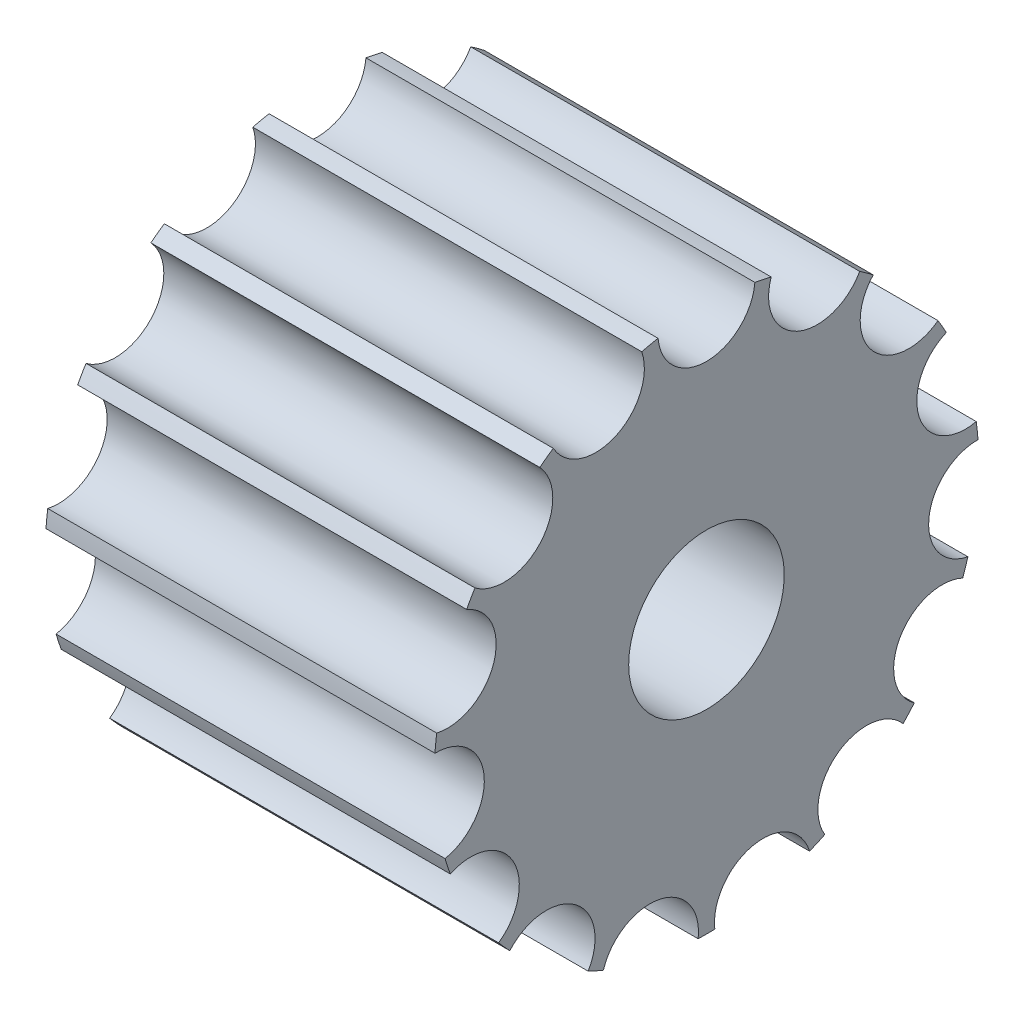
ISO-10303-21;
HEADER;
FILE_DESCRIPTION(('STEP AP214'),'2;1');
FILE_NAME('part.step','',(''),(''),'','','');
FILE_SCHEMA(('AUTOMOTIVE_DESIGN { 1 0 10303 214 1 1 1 1 }'));
ENDSEC;
DATA;
#1=APPLICATION_CONTEXT('core data for automotive mechanical design processes');
#2=APPLICATION_PROTOCOL_DEFINITION('international standard','automotive_design',2000,#1);
#3=PRODUCT_CONTEXT('',#1,'mechanical');
#4=PRODUCT('Part','Part','',(#3));
#5=PRODUCT_RELATED_PRODUCT_CATEGORY('part','',(#4));
#6=PRODUCT_DEFINITION_FORMATION('','',#4);
#7=PRODUCT_DEFINITION_CONTEXT('part definition',#1,'design');
#8=PRODUCT_DEFINITION('design','',#6,#7);
#9=PRODUCT_DEFINITION_SHAPE('','',#8);
#10=(LENGTH_UNIT() NAMED_UNIT(*) SI_UNIT(.MILLI.,.METRE.));
#11=(NAMED_UNIT(*) PLANE_ANGLE_UNIT() SI_UNIT($,.RADIAN.));
#12=(NAMED_UNIT(*) SI_UNIT($,.STERADIAN.) SOLID_ANGLE_UNIT());
#13=UNCERTAINTY_MEASURE_WITH_UNIT(LENGTH_MEASURE(1.E-05),#10,'distance_accuracy_value','');
#14=(GEOMETRIC_REPRESENTATION_CONTEXT(3) GLOBAL_UNCERTAINTY_ASSIGNED_CONTEXT((#13)) GLOBAL_UNIT_ASSIGNED_CONTEXT((#10,
#11,#12)) REPRESENTATION_CONTEXT('',''));
#15=CARTESIAN_POINT('',(0.,0.,0.));
#16=DIRECTION('',(0.,0.,1.));
#17=DIRECTION('',(1.,0.,0.));
#18=AXIS2_PLACEMENT_3D('',#15,#16,#17);
#19=CARTESIAN_POINT('',(-48.9644918561277,1.84719136614903,0.));
#20=DIRECTION('',(-1.,0.,0.));
#21=DIRECTION('',(0.,0.,1.));
#22=AXIS2_PLACEMENT_3D('',#19,#20,#21);
#23=CYLINDRICAL_SURFACE('',#22,7.);
#24=CARTESIAN_POINT('',(-27.3637349174757,1.84719136614903,0.));
#25=DIRECTION('',(-1.,0.,0.));
#26=DIRECTION('',(0.,0.,1.));
#27=AXIS2_PLACEMENT_3D('',#24,#25,#26);
#28=CIRCLE('',#27,7.);
#29=CARTESIAN_POINT('',(-27.3637349174757,-2.99383843144402,5.05612801448067));
#30=VERTEX_POINT('',#29);
#31=CARTESIAN_POINT('',(-27.3637349174757,-2.6752132446615,5.3430194212748));
#32=VERTEX_POINT('',#31);
#33=EDGE_CURVE('E255',#30,#32,#28,.T.);
#34=ORIENTED_EDGE('',*,*,#33,.F.);
#35=DIRECTION('',(-1.,0.,0.));
#36=VECTOR('',#35,1.);
#37=CARTESIAN_POINT('',(-10.3637349174757,-2.99383843144402,5.05612801448067));
#38=LINE('',#37,#36);
#39=CARTESIAN_POINT('',(-17.3637349174757,-2.99383843144402,5.05612801448067));
#40=VERTEX_POINT('',#39);
#41=EDGE_CURVE('E406',#40,#30,#38,.T.);
#42=ORIENTED_EDGE('',*,*,#41,.F.);
#43=CARTESIAN_POINT('',(-17.3637349174757,1.84719136614903,0.));
#44=DIRECTION('',(-1.,0.,0.));
#45=DIRECTION('',(0.,0.,1.));
#46=AXIS2_PLACEMENT_3D('',#43,#44,#45);
#47=CIRCLE('',#46,7.);
#48=CARTESIAN_POINT('',(-17.3637349174757,-2.6752132446615,5.3430194212748));
#49=VERTEX_POINT('',#48);
#50=EDGE_CURVE('E257',#40,#49,#47,.T.);
#51=ORIENTED_EDGE('',*,*,#50,.T.);
#52=DIRECTION('',(-1.,0.,0.));
#53=VECTOR('',#52,1.);
#54=CARTESIAN_POINT('',(-10.3637349174757,-2.6752132446615,5.3430194212748));
#55=LINE('',#54,#53);
#56=EDGE_CURVE('E240',#49,#32,#55,.T.);
#57=ORIENTED_EDGE('',*,*,#56,.T.);
#58=EDGE_LOOP('',(#34,#42,#51,#57));
#59=FACE_BOUND('',#58,.T.);
#60=ADVANCED_FACE('F39',(#59),#23,.T.);
#61=CARTESIAN_POINT('',(-17.3637349174757,-4.63182195132596,2.6499785719854));
#62=VERTEX_POINT('',#61);
#63=CARTESIAN_POINT('',(-17.3637349174757,-4.457432606977,3.04166345237019));
#64=VERTEX_POINT('',#63);
#65=EDGE_CURVE('E601',#62,#64,#47,.T.);
#66=ORIENTED_EDGE('',*,*,#65,.T.);
#67=DIRECTION('',(-1.,0.,0.));
#68=VECTOR('',#67,1.);
#69=CARTESIAN_POINT('',(-10.3637349174757,-4.457432606977,3.04166345237019));
#70=LINE('',#69,#68);
#71=CARTESIAN_POINT('',(-27.3637349174757,-4.457432606977,3.04166345237019));
#72=VERTEX_POINT('',#71);
#73=EDGE_CURVE('E409',#64,#72,#70,.T.);
#74=ORIENTED_EDGE('',*,*,#73,.T.);
#75=CARTESIAN_POINT('',(-27.3637349174757,-4.63182195132596,2.6499785719854));
#76=VERTEX_POINT('',#75);
#77=EDGE_CURVE('E265',#76,#72,#28,.T.);
#78=ORIENTED_EDGE('',*,*,#77,.F.);
#79=DIRECTION('',(-1.,0.,0.));
#80=VECTOR('',#79,1.);
#81=CARTESIAN_POINT('',(-10.3637349174757,-4.63182195132596,2.6499785719854));
#82=LINE('',#81,#80);
#83=EDGE_CURVE('E416',#62,#76,#82,.T.);
#84=ORIENTED_EDGE('',*,*,#83,.F.);
#85=EDGE_LOOP('',(#66,#74,#78,#84));
#86=FACE_BOUND('',#85,.T.);
#87=ADVANCED_FACE('F546',(#86),#23,.T.);
#88=CARTESIAN_POINT('',(-17.3637349174757,-5.14952520862831,-0.214376239905701));
#89=VERTEX_POINT('',#88);
#90=CARTESIAN_POINT('',(-17.3637349174757,-5.14952520862831,0.214376239905796));
#91=VERTEX_POINT('',#90);
#92=EDGE_CURVE('E595',#89,#91,#47,.T.);
#93=ORIENTED_EDGE('',*,*,#92,.T.);
#94=DIRECTION('',(-1.,0.,0.));
#95=VECTOR('',#94,1.);
#96=CARTESIAN_POINT('',(-10.3637349174757,-5.14952520862831,0.214376239905796));
#97=LINE('',#96,#95);
#98=CARTESIAN_POINT('',(-27.3637349174757,-5.14952520862831,0.214376239905796));
#99=VERTEX_POINT('',#98);
#100=EDGE_CURVE('E419',#91,#99,#97,.T.);
#101=ORIENTED_EDGE('',*,*,#100,.T.);
#102=CARTESIAN_POINT('',(-27.3637349174757,-5.14952520862831,-0.214376239905701));
#103=VERTEX_POINT('',#102);
#104=EDGE_CURVE('E269',#103,#99,#28,.T.);
#105=ORIENTED_EDGE('',*,*,#104,.F.);
#106=DIRECTION('',(-1.,0.,0.));
#107=VECTOR('',#106,1.);
#108=CARTESIAN_POINT('',(-10.3637349174757,-5.14952520862831,-0.214376239905701));
#109=LINE('',#108,#107);
#110=EDGE_CURVE('E426',#89,#103,#109,.T.);
#111=ORIENTED_EDGE('',*,*,#110,.F.);
#112=EDGE_LOOP('',(#93,#101,#105,#111));
#113=FACE_BOUND('',#112,.T.);
#114=ADVANCED_FACE('F550',(#113),#23,.T.);
#115=CARTESIAN_POINT('',(-17.3637349174757,-4.45743260697704,-3.04166345237011));
#116=VERTEX_POINT('',#115);
#117=CARTESIAN_POINT('',(-17.3637349174757,-4.631821951326,-2.64997857198531));
#118=VERTEX_POINT('',#117);
#119=EDGE_CURVE('E589',#116,#118,#47,.T.);
#120=ORIENTED_EDGE('',*,*,#119,.T.);
#121=DIRECTION('',(-1.,0.,0.));
#122=VECTOR('',#121,1.);
#123=CARTESIAN_POINT('',(-10.3637349174757,-4.631821951326,-2.64997857198531));
#124=LINE('',#123,#122);
#125=CARTESIAN_POINT('',(-27.3637349174757,-4.631821951326,-2.64997857198531));
#126=VERTEX_POINT('',#125);
#127=EDGE_CURVE('E429',#118,#126,#124,.T.);
#128=ORIENTED_EDGE('',*,*,#127,.T.);
#129=CARTESIAN_POINT('',(-27.3637349174757,-4.45743260697704,-3.0416634523701));
#130=VERTEX_POINT('',#129);
#131=EDGE_CURVE('E895',#130,#126,#28,.T.);
#132=ORIENTED_EDGE('',*,*,#131,.F.);
#133=DIRECTION('',(-1.,0.,0.));
#134=VECTOR('',#133,1.);
#135=CARTESIAN_POINT('',(-10.3637349174757,-4.45743260697704,-3.04166345237011));
#136=LINE('',#135,#134);
#137=EDGE_CURVE('E436',#116,#130,#136,.T.);
#138=ORIENTED_EDGE('',*,*,#137,.F.);
#139=EDGE_LOOP('',(#120,#128,#132,#138));
#140=FACE_BOUND('',#139,.T.);
#141=ADVANCED_FACE('F781',(#140),#23,.T.);
#142=CARTESIAN_POINT('',(-17.3637349174757,-2.67521324466158,-5.34301942127474));
#143=VERTEX_POINT('',#142);
#144=CARTESIAN_POINT('',(-17.3637349174757,-2.99383843144409,-5.0561280144806));
#145=VERTEX_POINT('',#144);
#146=EDGE_CURVE('E583',#143,#145,#47,.T.);
#147=ORIENTED_EDGE('',*,*,#146,.T.);
#148=DIRECTION('',(-1.,0.,0.));
#149=VECTOR('',#148,1.);
#150=CARTESIAN_POINT('',(-10.3637349174757,-2.99383843144409,-5.0561280144806));
#151=LINE('',#150,#149);
#152=CARTESIAN_POINT('',(-27.3637349174757,-2.99383843144409,-5.0561280144806));
#153=VERTEX_POINT('',#152);
#154=EDGE_CURVE('E377',#145,#153,#151,.T.);
#155=ORIENTED_EDGE('',*,*,#154,.T.);
#156=CARTESIAN_POINT('',(-27.3637349174757,-2.67521324466157,-5.34301942127474));
#157=VERTEX_POINT('',#156);
#158=EDGE_CURVE('E890',#157,#153,#28,.T.);
#159=ORIENTED_EDGE('',*,*,#158,.F.);
#160=DIRECTION('',(-1.,0.,0.));
#161=VECTOR('',#160,1.);
#162=CARTESIAN_POINT('',(-10.3637349174757,-2.67521324466158,-5.34301942127474));
#163=LINE('',#162,#161);
#164=EDGE_CURVE('E366',#143,#157,#163,.T.);
#165=ORIENTED_EDGE('',*,*,#164,.F.);
#166=EDGE_LOOP('',(#147,#155,#159,#165));
#167=FACE_BOUND('',#166,.T.);
#168=ADVANCED_FACE('F788',(#167),#23,.T.);
#169=CARTESIAN_POINT('',(-17.3637349174757,-0.111029040380856,-6.72051879243336));
#170=VERTEX_POINT('',#169);
#171=CARTESIAN_POINT('',(-17.3637349174757,-0.518796880183285,-6.5880269897912));
#172=VERTEX_POINT('',#171);
#173=EDGE_CURVE('E577',#170,#172,#47,.T.);
#174=ORIENTED_EDGE('',*,*,#173,.T.);
#175=DIRECTION('',(-1.,0.,0.));
#176=VECTOR('',#175,1.);
#177=CARTESIAN_POINT('',(-10.3637349174757,-0.518796880183285,-6.5880269897912));
#178=LINE('',#177,#176);
#179=CARTESIAN_POINT('',(-27.3637349174757,-0.518796880183285,-6.5880269897912));
#180=VERTEX_POINT('',#179);
#181=EDGE_CURVE('E369',#172,#180,#178,.T.);
#182=ORIENTED_EDGE('',*,*,#181,.T.);
#183=CARTESIAN_POINT('',(-27.3637349174757,-0.111029040380855,-6.72051879243336));
#184=VERTEX_POINT('',#183);
#185=EDGE_CURVE('E885',#184,#180,#28,.T.);
#186=ORIENTED_EDGE('',*,*,#185,.F.);
#187=DIRECTION('',(-1.,0.,0.));
#188=VECTOR('',#187,1.);
#189=CARTESIAN_POINT('',(-10.3637349174757,-0.111029040380856,-6.72051879243336));
#190=LINE('',#189,#188);
#191=EDGE_CURVE('E378',#170,#184,#190,.T.);
#192=ORIENTED_EDGE('',*,*,#191,.F.);
#193=EDGE_LOOP('',(#174,#182,#186,#192));
#194=FACE_BOUND('',#193,.T.);
#195=ADVANCED_FACE('F795',(#194),#23,.T.);
#196=CARTESIAN_POINT('',(-17.3637349174757,2.79174926206279,-6.93597941038373));
#197=VERTEX_POINT('',#196);
#198=CARTESIAN_POINT('',(-17.3637349174757,2.36534553319681,-6.98079624822061));
#199=VERTEX_POINT('',#198);
#200=EDGE_CURVE('E571',#197,#199,#47,.T.);
#201=ORIENTED_EDGE('',*,*,#200,.T.);
#202=DIRECTION('',(-1.,0.,0.));
#203=VECTOR('',#202,1.);
#204=CARTESIAN_POINT('',(-10.3637349174757,2.36534553319681,-6.98079624822061));
#205=LINE('',#204,#203);
#206=CARTESIAN_POINT('',(-27.3637349174757,2.36534553319681,-6.98079624822061));
#207=VERTEX_POINT('',#206);
#208=EDGE_CURVE('E381',#199,#207,#205,.T.);
#209=ORIENTED_EDGE('',*,*,#208,.T.);
#210=CARTESIAN_POINT('',(-27.3637349174757,2.79174926206279,-6.93597941038372));
#211=VERTEX_POINT('',#210);
#212=EDGE_CURVE('E880',#211,#207,#28,.T.);
#213=ORIENTED_EDGE('',*,*,#212,.F.);
#214=DIRECTION('',(-1.,0.,0.));
#215=VECTOR('',#214,1.);
#216=CARTESIAN_POINT('',(-10.3637349174757,2.79174926206279,-6.93597941038373));
#217=LINE('',#216,#215);
#218=EDGE_CURVE('E388',#197,#211,#217,.T.);
#219=ORIENTED_EDGE('',*,*,#218,.F.);
#220=EDGE_LOOP('',(#201,#209,#213,#219));
#221=FACE_BOUND('',#220,.T.);
#222=ADVANCED_FACE('F802',(#221),#23,.T.);
#223=CARTESIAN_POINT('',(-17.3637349174757,5.53120492326384,-5.95214617688395));
#224=VERTEX_POINT('',#223);
#225=CARTESIAN_POINT('',(-17.3637349174757,5.15989438381151,-6.1665224167897));
#226=VERTEX_POINT('',#225);
#227=EDGE_CURVE('E568',#224,#226,#47,.T.);
#228=ORIENTED_EDGE('',*,*,#227,.T.);
#229=DIRECTION('',(-1.,0.,0.));
#230=VECTOR('',#229,1.);
#231=CARTESIAN_POINT('',(-10.3637349174757,5.15989438381151,-6.1665224167897));
#232=LINE('',#231,#230);
#233=CARTESIAN_POINT('',(-27.3637349174757,5.15989438381151,-6.1665224167897));
#234=VERTEX_POINT('',#233);
#235=EDGE_CURVE('E391',#226,#234,#232,.T.);
#236=ORIENTED_EDGE('',*,*,#235,.T.);
#237=CARTESIAN_POINT('',(-27.3637349174757,5.53120492326384,-5.95214617688395));
#238=VERTEX_POINT('',#237);
#239=EDGE_CURVE('E877',#238,#234,#28,.T.);
#240=ORIENTED_EDGE('',*,*,#239,.F.);
#241=DIRECTION('',(-1.,0.,0.));
#242=VECTOR('',#241,1.);
#243=CARTESIAN_POINT('',(-10.3637349174757,5.53120492326384,-5.95214617688395));
#244=LINE('',#243,#242);
#245=EDGE_CURVE('E398',#224,#238,#244,.T.);
#246=ORIENTED_EDGE('',*,*,#245,.F.);
#247=EDGE_LOOP('',(#228,#236,#240,#246));
#248=FACE_BOUND('',#247,.T.);
#249=ADVANCED_FACE('F809',(#248),#23,.T.);
#250=CARTESIAN_POINT('',(-27.3637349174757,-0.518796880183195,6.58802698979124));
#251=VERTEX_POINT('',#250);
#252=CARTESIAN_POINT('',(-27.3637349174757,-0.111029040380764,6.72051879243339));
#253=VERTEX_POINT('',#252);
#254=EDGE_CURVE('E266',#251,#253,#28,.T.);
#255=ORIENTED_EDGE('',*,*,#254,.F.);
#256=DIRECTION('',(-1.,0.,0.));
#257=VECTOR('',#256,1.);
#258=CARTESIAN_POINT('',(-10.3637349174757,-0.518796880183194,6.58802698979124));
#259=LINE('',#258,#257);
#260=CARTESIAN_POINT('',(-17.3637349174757,-0.518796880183194,6.58802698979124));
#261=VERTEX_POINT('',#260);
#262=EDGE_CURVE('E243',#261,#251,#259,.T.);
#263=ORIENTED_EDGE('',*,*,#262,.F.);
#264=CARTESIAN_POINT('',(-17.3637349174757,-0.111029040380764,6.72051879243339));
#265=VERTEX_POINT('',#264);
#266=EDGE_CURVE('E515',#261,#265,#47,.T.);
#267=ORIENTED_EDGE('',*,*,#266,.T.);
#268=DIRECTION('',(-1.,0.,0.));
#269=VECTOR('',#268,1.);
#270=CARTESIAN_POINT('',(-10.3637349174757,-0.111029040380764,6.72051879243339));
#271=LINE('',#270,#269);
#272=EDGE_CURVE('E249',#265,#253,#271,.T.);
#273=ORIENTED_EDGE('',*,*,#272,.T.);
#274=EDGE_LOOP('',(#255,#263,#267,#273));
#275=FACE_BOUND('',#274,.T.);
#276=ADVANCED_FACE('F614',(#275),#23,.T.);
#277=CARTESIAN_POINT('',(-27.3637349174757,2.3653455331969,6.98079624822061));
#278=VERTEX_POINT('',#277);
#279=CARTESIAN_POINT('',(-27.3637349174757,2.79174926206288,6.93597941038371));
#280=VERTEX_POINT('',#279);
#281=EDGE_CURVE('E270',#278,#280,#28,.T.);
#282=ORIENTED_EDGE('',*,*,#281,.F.);
#283=DIRECTION('',(-1.,0.,0.));
#284=VECTOR('',#283,1.);
#285=CARTESIAN_POINT('',(-10.3637349174757,2.3653455331969,6.98079624822061));
#286=LINE('',#285,#284);
#287=CARTESIAN_POINT('',(-17.3637349174757,2.3653455331969,6.98079624822061));
#288=VERTEX_POINT('',#287);
#289=EDGE_CURVE('E473',#288,#278,#286,.T.);
#290=ORIENTED_EDGE('',*,*,#289,.F.);
#291=CARTESIAN_POINT('',(-17.3637349174757,2.79174926206288,6.93597941038371));
#292=VERTEX_POINT('',#291);
#293=EDGE_CURVE('E500',#288,#292,#47,.T.);
#294=ORIENTED_EDGE('',*,*,#293,.T.);
#295=DIRECTION('',(-1.,0.,0.));
#296=VECTOR('',#295,1.);
#297=CARTESIAN_POINT('',(-10.3637349174757,2.79174926206288,6.93597941038371));
#298=LINE('',#297,#296);
#299=EDGE_CURVE('E466',#292,#280,#298,.T.);
#300=ORIENTED_EDGE('',*,*,#299,.T.);
#301=EDGE_LOOP('',(#282,#290,#294,#300));
#302=FACE_BOUND('',#301,.T.);
#303=ADVANCED_FACE('F497',(#302),#23,.T.);
#304=CARTESIAN_POINT('',(-27.3637349174757,5.15989438381159,6.16652241678965));
#305=VERTEX_POINT('',#304);
#306=CARTESIAN_POINT('',(-27.3637349174757,5.53120492326393,5.9521461768839));
#307=VERTEX_POINT('',#306);
#308=EDGE_CURVE('E487',#305,#307,#28,.T.);
#309=ORIENTED_EDGE('',*,*,#308,.F.);
#310=DIRECTION('',(-1.,0.,0.));
#311=VECTOR('',#310,1.);
#312=CARTESIAN_POINT('',(-10.3637349174757,5.1598943838116,6.16652241678965));
#313=LINE('',#312,#311);
#314=CARTESIAN_POINT('',(-17.3637349174757,5.1598943838116,6.16652241678965));
#315=VERTEX_POINT('',#314);
#316=EDGE_CURVE('E463',#315,#305,#313,.T.);
#317=ORIENTED_EDGE('',*,*,#316,.F.);
#318=CARTESIAN_POINT('',(-17.3637349174757,5.53120492326393,5.9521461768839));
#319=VERTEX_POINT('',#318);
#320=EDGE_CURVE('E508',#315,#319,#47,.T.);
#321=ORIENTED_EDGE('',*,*,#320,.T.);
#322=DIRECTION('',(-1.,0.,0.));
#323=VECTOR('',#322,1.);
#324=CARTESIAN_POINT('',(-10.3637349174757,5.53120492326393,5.9521461768839));
#325=LINE('',#324,#323);
#326=EDGE_CURVE('E456',#319,#307,#325,.T.);
#327=ORIENTED_EDGE('',*,*,#326,.T.);
#328=EDGE_LOOP('',(#309,#317,#321,#327));
#329=FACE_BOUND('',#328,.T.);
#330=ADVANCED_FACE('F538',(#329),#23,.T.);
#331=CARTESIAN_POINT('',(-27.3637349174757,7.3816467877103,4.28600083839831));
#332=VERTEX_POINT('',#331);
#333=CARTESIAN_POINT('',(-27.3637349174757,7.63366117222732,3.9391327958504));
#334=VERTEX_POINT('',#333);
#335=EDGE_CURVE('E484',#332,#334,#28,.T.);
#336=ORIENTED_EDGE('',*,*,#335,.F.);
#337=DIRECTION('',(-1.,0.,0.));
#338=VECTOR('',#337,1.);
#339=CARTESIAN_POINT('',(-10.3637349174757,7.3816467877103,4.28600083839831));
#340=LINE('',#339,#338);
#341=CARTESIAN_POINT('',(-17.3637349174757,7.3816467877103,4.28600083839831));
#342=VERTEX_POINT('',#341);
#343=EDGE_CURVE('E64',#342,#332,#340,.T.);
#344=ORIENTED_EDGE('',*,*,#343,.F.);
#345=CARTESIAN_POINT('',(-17.3637349174757,7.63366117222732,3.9391327958504));
#346=VERTEX_POINT('',#345);
#347=EDGE_CURVE('E512',#342,#346,#47,.T.);
#348=ORIENTED_EDGE('',*,*,#347,.T.);
#349=DIRECTION('',(-1.,0.,0.));
#350=VECTOR('',#349,1.);
#351=CARTESIAN_POINT('',(-10.3637349174757,7.63366117222732,3.9391327958504));
#352=LINE('',#351,#350);
#353=EDGE_CURVE('E446',#346,#334,#352,.T.);
#354=ORIENTED_EDGE('',*,*,#353,.T.);
#355=EDGE_LOOP('',(#336,#344,#348,#354));
#356=FACE_BOUND('',#355,.T.);
#357=ADVANCED_FACE('F536',(#356),#23,.T.);
#358=CARTESIAN_POINT('',(-27.3637349174757,8.64644157027199,1.66439077795265));
#359=VERTEX_POINT('',#358);
#360=CARTESIAN_POINT('',(-27.3637349174757,8.73558422329188,1.24500756851646));
#361=VERTEX_POINT('',#360);
#362=EDGE_CURVE('E276',#359,#361,#28,.T.);
#363=ORIENTED_EDGE('',*,*,#362,.F.);
#364=DIRECTION('',(-1.,0.,0.));
#365=VECTOR('',#364,1.);
#366=CARTESIAN_POINT('',(-10.3637349174757,8.64644157027199,1.66439077795265));
#367=LINE('',#366,#365);
#368=CARTESIAN_POINT('',(-17.3637349174757,8.64644157027199,1.66439077795265));
#369=VERTEX_POINT('',#368);
#370=EDGE_CURVE('E56',#369,#359,#367,.T.);
#371=ORIENTED_EDGE('',*,*,#370,.F.);
#372=CARTESIAN_POINT('',(-17.3637349174757,8.73558422329188,1.24500756851646));
#373=VERTEX_POINT('',#372);
#374=EDGE_CURVE('E49',#369,#373,#47,.T.);
#375=ORIENTED_EDGE('',*,*,#374,.T.);
#376=DIRECTION('',(-1.,0.,0.));
#377=VECTOR('',#376,1.);
#378=CARTESIAN_POINT('',(-10.3637349174757,8.73558422329188,1.24500756851646));
#379=LINE('',#378,#377);
#380=EDGE_CURVE('E289',#373,#361,#379,.T.);
#381=ORIENTED_EDGE('',*,*,#380,.T.);
#382=EDGE_LOOP('',(#363,#371,#375,#381));
#383=FACE_BOUND('',#382,.T.);
#384=ADVANCED_FACE('F523',(#383),#23,.T.);
#385=CARTESIAN_POINT('',(-17.3637349174757,7.63366117222727,-3.93913279585048));
#386=VERTEX_POINT('',#385);
#387=CARTESIAN_POINT('',(-17.3637349174757,7.38164678771024,-4.28600083839838));
#388=VERTEX_POINT('',#387);
#389=EDGE_CURVE('E48',#386,#388,#47,.T.);
#390=ORIENTED_EDGE('',*,*,#389,.T.);
#391=DIRECTION('',(-1.,0.,0.));
#392=VECTOR('',#391,1.);
#393=CARTESIAN_POINT('',(-10.3637349174757,7.38164678771024,-4.28600083839838));
#394=LINE('',#393,#392);
#395=CARTESIAN_POINT('',(-27.3637349174757,7.38164678771024,-4.28600083839838));
#396=VERTEX_POINT('',#395);
#397=EDGE_CURVE('E365',#388,#396,#394,.T.);
#398=ORIENTED_EDGE('',*,*,#397,.T.);
#399=CARTESIAN_POINT('',(-27.3637349174757,7.63366117222727,-3.93913279585048));
#400=VERTEX_POINT('',#399);
#401=EDGE_CURVE('E275',#400,#396,#28,.T.);
#402=ORIENTED_EDGE('',*,*,#401,.F.);
#403=DIRECTION('',(-1.,0.,0.));
#404=VECTOR('',#403,1.);
#405=CARTESIAN_POINT('',(-10.3637349174757,7.63366117222727,-3.93913279585048));
#406=LINE('',#405,#404);
#407=EDGE_CURVE('E356',#386,#400,#406,.T.);
#408=ORIENTED_EDGE('',*,*,#407,.F.);
#409=EDGE_LOOP('',(#390,#398,#402,#408));
#410=FACE_BOUND('',#409,.T.);
#411=ADVANCED_FACE('F543',(#410),#23,.T.);
#412=CARTESIAN_POINT('',(-17.3637349174757,8.84719136614903,0.));
#413=DIRECTION('',(-1.,0.,0.));
#414=DIRECTION('',(0.,0.,1.));
#415=AXIS2_PLACEMENT_3D('',#412,#413,#414);
#416=PLANE('',#415);
#417=ORIENTED_EDGE('',*,*,#50,.F.);
#418=CARTESIAN_POINT('',(-17.3637349174757,-3.81592759447557,4.11449676604736));
#419=DIRECTION('',(-1.,0.,0.));
#420=DIRECTION('',(0.,0.,1.));
#421=AXIS2_PLACEMENT_3D('',#418,#419,#420);
#422=CIRCLE('',#421,1.25);
#423=EDGE_CURVE('E300',#40,#64,#422,.T.);
#424=ORIENTED_EDGE('',*,*,#423,.T.);
#425=ORIENTED_EDGE('',*,*,#65,.F.);
#426=CARTESIAN_POINT('',(-17.3637349174757,-4.9998418389876,1.45538183572436));
#427=DIRECTION('',(-1.,0.,0.));
#428=DIRECTION('',(0.,0.,1.));
#429=AXIS2_PLACEMENT_3D('',#426,#427,#428);
#430=CIRCLE('',#429,1.25);
#431=EDGE_CURVE('E304',#62,#91,#430,.T.);
#432=ORIENTED_EDGE('',*,*,#431,.T.);
#433=ORIENTED_EDGE('',*,*,#92,.F.);
#434=CARTESIAN_POINT('',(-17.3637349174757,-4.99984183898762,-1.45538183572427));
#435=DIRECTION('',(-1.,0.,0.));
#436=DIRECTION('',(0.,0.,1.));
#437=AXIS2_PLACEMENT_3D('',#434,#435,#436);
#438=CIRCLE('',#437,1.25);
#439=EDGE_CURVE('E308',#89,#118,#438,.T.);
#440=ORIENTED_EDGE('',*,*,#439,.T.);
#441=ORIENTED_EDGE('',*,*,#119,.F.);
#442=CARTESIAN_POINT('',(-17.3637349174757,-3.81592759447563,-4.11449676604728));
#443=DIRECTION('',(-1.,0.,0.));
#444=DIRECTION('',(0.,0.,1.));
#445=AXIS2_PLACEMENT_3D('',#442,#443,#444);
#446=CIRCLE('',#445,1.25);
#447=EDGE_CURVE('E312',#116,#145,#446,.T.);
#448=ORIENTED_EDGE('',*,*,#447,.T.);
#449=ORIENTED_EDGE('',*,*,#146,.F.);
#450=CARTESIAN_POINT('',(-17.3637349174757,-1.652808633851,-6.06217782649105));
#451=DIRECTION('',(-1.,0.,0.));
#452=DIRECTION('',(0.,0.,1.));
#453=AXIS2_PLACEMENT_3D('',#450,#451,#452);
#454=CIRCLE('',#453,1.25);
#455=EDGE_CURVE('E316',#143,#172,#454,.T.);
#456=ORIENTED_EDGE('',*,*,#455,.T.);
#457=ORIENTED_EDGE('',*,*,#173,.F.);
#458=CARTESIAN_POINT('',(-17.3637349174757,1.11549212327543,-6.96165326757791));
#459=DIRECTION('',(-1.,0.,0.));
#460=DIRECTION('',(0.,0.,1.));
#461=AXIS2_PLACEMENT_3D('',#458,#459,#460);
#462=CIRCLE('',#461,1.25);
#463=EDGE_CURVE('E320',#170,#199,#462,.T.);
#464=ORIENTED_EDGE('',*,*,#463,.T.);
#465=ORIENTED_EDGE('',*,*,#200,.F.);
#466=CARTESIAN_POINT('',(-17.3637349174757,4.01031032677364,-6.65739561406608));
#467=DIRECTION('',(-1.,0.,0.));
#468=DIRECTION('',(0.,0.,1.));
#469=AXIS2_PLACEMENT_3D('',#466,#467,#468);
#470=CIRCLE('',#469,1.25);
#471=EDGE_CURVE('E324',#197,#226,#470,.T.);
#472=ORIENTED_EDGE('',*,*,#471,.T.);
#473=ORIENTED_EDGE('',*,*,#227,.F.);
#474=CARTESIAN_POINT('',(-17.3637349174757,6.53110561066102,-5.20201377834177));
#475=DIRECTION('',(-1.,0.,0.));
#476=DIRECTION('',(0.,0.,1.));
#477=AXIS2_PLACEMENT_3D('',#474,#475,#476);
#478=CIRCLE('',#477,1.25);
#479=EDGE_CURVE('E328',#224,#388,#478,.T.);
#480=ORIENTED_EDGE('',*,*,#479,.T.);
#481=ORIENTED_EDGE('',*,*,#389,.F.);
#482=CARTESIAN_POINT('',(-17.3637349174757,8.24200956964723,-2.84715650153061));
#483=DIRECTION('',(-1.,0.,0.));
#484=DIRECTION('',(0.,0.,1.));
#485=AXIS2_PLACEMENT_3D('',#482,#483,#484);
#486=CIRCLE('',#485,1.25);
#487=CARTESIAN_POINT('',(-17.3637349174757,8.64644157027197,-1.66439077795274));
#488=VERTEX_POINT('',#487);
#489=EDGE_CURVE('E351',#386,#488,#486,.T.);
#490=ORIENTED_EDGE('',*,*,#489,.T.);
#491=CARTESIAN_POINT('',(-17.3637349174757,8.73558422329188,-1.24500756851646));
#492=VERTEX_POINT('',#491);
#493=EDGE_CURVE('E11',#492,#488,#47,.T.);
#494=ORIENTED_EDGE('',*,*,#493,.F.);
#495=CARTESIAN_POINT('',(-17.3637349174757,8.84719136614902,0.));
#496=DIRECTION('',(-1.,0.,0.));
#497=DIRECTION('',(0.,0.,1.));
#498=AXIS2_PLACEMENT_3D('',#495,#496,#497);
#499=CIRCLE('',#498,1.25);
#500=EDGE_CURVE('E285',#492,#373,#499,.T.);
#501=ORIENTED_EDGE('',*,*,#500,.T.);
#502=ORIENTED_EDGE('',*,*,#374,.F.);
#503=CARTESIAN_POINT('',(-17.3637349174757,8.24200956964727,2.84715650153052));
#504=DIRECTION('',(-1.,0.,0.));
#505=DIRECTION('',(0.,0.,1.));
#506=AXIS2_PLACEMENT_3D('',#503,#504,#505);
#507=CIRCLE('',#506,1.25);
#508=EDGE_CURVE('E347',#369,#346,#507,.T.);
#509=ORIENTED_EDGE('',*,*,#508,.T.);
#510=ORIENTED_EDGE('',*,*,#347,.F.);
#511=CARTESIAN_POINT('',(-17.3637349174757,6.5311056106611,5.2020137783417));
#512=DIRECTION('',(-1.,0.,0.));
#513=DIRECTION('',(0.,0.,1.));
#514=AXIS2_PLACEMENT_3D('',#511,#512,#513);
#515=CIRCLE('',#514,1.25);
#516=EDGE_CURVE('E343',#342,#319,#515,.T.);
#517=ORIENTED_EDGE('',*,*,#516,.T.);
#518=ORIENTED_EDGE('',*,*,#320,.F.);
#519=CARTESIAN_POINT('',(-17.3637349174757,4.01031032677373,6.65739561406605));
#520=DIRECTION('',(-1.,0.,0.));
#521=DIRECTION('',(0.,0.,1.));
#522=AXIS2_PLACEMENT_3D('',#519,#520,#521);
#523=CIRCLE('',#522,1.25);
#524=EDGE_CURVE('E339',#315,#292,#523,.T.);
#525=ORIENTED_EDGE('',*,*,#524,.T.);
#526=ORIENTED_EDGE('',*,*,#293,.F.);
#527=CARTESIAN_POINT('',(-17.3637349174757,1.11549212327552,6.96165326757792));
#528=DIRECTION('',(-1.,0.,0.));
#529=DIRECTION('',(0.,0.,1.));
#530=AXIS2_PLACEMENT_3D('',#527,#528,#529);
#531=CIRCLE('',#530,1.25);
#532=EDGE_CURVE('E335',#288,#265,#531,.T.);
#533=ORIENTED_EDGE('',*,*,#532,.T.);
#534=ORIENTED_EDGE('',*,*,#266,.F.);
#535=CARTESIAN_POINT('',(-17.3637349174757,-1.65280863385092,6.0621778264911));
#536=DIRECTION('',(-1.,0.,0.));
#537=DIRECTION('',(0.,0.,1.));
#538=AXIS2_PLACEMENT_3D('',#535,#536,#537);
#539=CIRCLE('',#538,1.25);
#540=EDGE_CURVE('E332',#261,#49,#539,.T.);
#541=ORIENTED_EDGE('',*,*,#540,.T.);
#542=EDGE_LOOP('',(#417,#424,#425,#432,#433,#440,#441,#448,#449,#456,#457,#464,#465,#472,#473,
#480,#481,#490,#494,#501,#502,#509,#510,#517,#518,#525,#526,#533,#534,#541));
#543=FACE_BOUND('',#542,.T.);
#544=CARTESIAN_POINT('',(-17.3637349174757,1.84719136614903,0.));
#545=DIRECTION('',(-1.,0.,0.));
#546=DIRECTION('',(0.,0.,1.));
#547=AXIS2_PLACEMENT_3D('',#544,#545,#546);
#548=CIRCLE('',#547,2.);
#549=CARTESIAN_POINT('',(-17.3637349174757,1.84719136614903,2.));
#550=VERTEX_POINT('',#549);
#551=EDGE_CURVE('E277',#550,#550,#548,.T.);
#552=ORIENTED_EDGE('',*,*,#551,.T.);
#553=EDGE_LOOP('',(#552));
#554=FACE_BOUND('',#553,.T.);
#555=ADVANCED_FACE('F41',(#543,#554),#416,.F.);
#556=ORIENTED_EDGE('',*,*,#493,.T.);
#557=DIRECTION('',(-1.,0.,0.));
#558=VECTOR('',#557,1.);
#559=CARTESIAN_POINT('',(-10.3637349174757,8.64644157027197,-1.66439077795274));
#560=LINE('',#559,#558);
#561=CARTESIAN_POINT('',(-27.3637349174757,8.64644157027197,-1.66439077795274));
#562=VERTEX_POINT('',#561);
#563=EDGE_CURVE('E355',#488,#562,#560,.T.);
#564=ORIENTED_EDGE('',*,*,#563,.T.);
#565=CARTESIAN_POINT('',(-27.3637349174757,8.73558422329188,-1.24500756851646));
#566=VERTEX_POINT('',#565);
#567=EDGE_CURVE('E271',#566,#562,#28,.T.);
#568=ORIENTED_EDGE('',*,*,#567,.F.);
#569=DIRECTION('',(-1.,0.,0.));
#570=VECTOR('',#569,1.);
#571=CARTESIAN_POINT('',(-10.3637349174757,8.73558422329188,-1.24500756851646));
#572=LINE('',#571,#570);
#573=EDGE_CURVE('E290',#492,#566,#572,.T.);
#574=ORIENTED_EDGE('',*,*,#573,.F.);
#575=EDGE_LOOP('',(#556,#564,#568,#574));
#576=FACE_BOUND('',#575,.T.);
#577=ADVANCED_FACE('F531',(#576),#23,.T.);
#578=CARTESIAN_POINT('',(-27.3637349174757,8.84719136614902,0.));
#579=DIRECTION('',(1.,0.,0.));
#580=DIRECTION('',(0.,0.,-1.));
#581=AXIS2_PLACEMENT_3D('',#578,#579,#580);
#582=PLANE('',#581);
#583=CARTESIAN_POINT('',(-27.3637349174757,1.84719136614903,0.));
#584=DIRECTION('',(1.,0.,0.));
#585=DIRECTION('',(0.,0.,-1.));
#586=AXIS2_PLACEMENT_3D('',#583,#584,#585);
#587=CIRCLE('',#586,2.);
#588=CARTESIAN_POINT('',(-27.3637349174757,1.84719136614903,-2.));
#589=VERTEX_POINT('',#588);
#590=EDGE_CURVE('E281',#589,#589,#587,.T.);
#591=ORIENTED_EDGE('',*,*,#590,.T.);
#592=EDGE_LOOP('',(#591));
#593=FACE_BOUND('',#592,.T.);
#594=ORIENTED_EDGE('',*,*,#77,.T.);
#595=CARTESIAN_POINT('',(-27.3637349174757,-3.81592759447557,4.11449676604736));
#596=DIRECTION('',(-1.,0.,0.));
#597=DIRECTION('',(0.,-0.58778525229248,-0.809016994374943));
#598=AXIS2_PLACEMENT_3D('',#595,#596,#597);
#599=CIRCLE('',#598,1.25);
#600=EDGE_CURVE('E259',#30,#72,#599,.T.);
#601=ORIENTED_EDGE('',*,*,#600,.F.);
#602=ORIENTED_EDGE('',*,*,#33,.T.);
#603=CARTESIAN_POINT('',(-27.3637349174757,-1.65280863385092,6.0621778264911));
#604=DIRECTION('',(-1.,0.,0.));
#605=DIRECTION('',(0.,-0.866025403784443,-0.499999999999992));
#606=AXIS2_PLACEMENT_3D('',#603,#604,#605);
#607=CIRCLE('',#606,1.25);
#608=EDGE_CURVE('E237',#251,#32,#607,.T.);
#609=ORIENTED_EDGE('',*,*,#608,.F.);
#610=ORIENTED_EDGE('',*,*,#254,.T.);
#611=CARTESIAN_POINT('',(-27.3637349174757,1.11549212327552,6.96165326757792));
#612=DIRECTION('',(-1.,0.,0.));
#613=DIRECTION('',(0.,-0.994521895368274,-0.104528463267644));
#614=AXIS2_PLACEMENT_3D('',#611,#612,#613);
#615=CIRCLE('',#614,1.25);
#616=EDGE_CURVE('E470',#278,#253,#615,.T.);
#617=ORIENTED_EDGE('',*,*,#616,.F.);
#618=ORIENTED_EDGE('',*,*,#281,.T.);
#619=CARTESIAN_POINT('',(-27.3637349174757,4.01031032677373,6.65739561406605));
#620=DIRECTION('',(-1.,0.,0.));
#621=DIRECTION('',(0.,-0.95105651629515,0.309016994374957));
#622=AXIS2_PLACEMENT_3D('',#619,#620,#621);
#623=CIRCLE('',#622,1.25);
#624=EDGE_CURVE('E460',#305,#280,#623,.T.);
#625=ORIENTED_EDGE('',*,*,#624,.F.);
#626=ORIENTED_EDGE('',*,*,#308,.T.);
#627=CARTESIAN_POINT('',(-27.3637349174757,6.5311056106611,5.2020137783417));
#628=DIRECTION('',(-1.,0.,0.));
#629=DIRECTION('',(0.,-0.743144825477386,0.669130606358867));
#630=AXIS2_PLACEMENT_3D('',#627,#628,#629);
#631=CIRCLE('',#630,1.25);
#632=EDGE_CURVE('E451',#332,#307,#631,.T.);
#633=ORIENTED_EDGE('',*,*,#632,.F.);
#634=ORIENTED_EDGE('',*,*,#335,.T.);
#635=CARTESIAN_POINT('',(-27.3637349174757,8.24200956964727,2.84715650153052));
#636=DIRECTION('',(-1.,0.,0.));
#637=DIRECTION('',(0.,-0.406736643075789,0.913545457642606));
#638=AXIS2_PLACEMENT_3D('',#635,#636,#637);
#639=CIRCLE('',#638,1.25);
#640=EDGE_CURVE('E447',#359,#334,#639,.T.);
#641=ORIENTED_EDGE('',*,*,#640,.F.);
#642=ORIENTED_EDGE('',*,*,#362,.T.);
#643=CARTESIAN_POINT('',(-27.3637349174757,8.84719136614902,0.));
#644=DIRECTION('',(-1.,0.,0.));
#645=DIRECTION('',(0.,0.,1.));
#646=AXIS2_PLACEMENT_3D('',#643,#644,#645);
#647=CIRCLE('',#646,1.25);
#648=EDGE_CURVE('E293',#566,#361,#647,.T.);
#649=ORIENTED_EDGE('',*,*,#648,.F.);
#650=ORIENTED_EDGE('',*,*,#567,.T.);
#651=CARTESIAN_POINT('',(-27.3637349174757,8.24200956964723,-2.84715650153061));
#652=DIRECTION('',(-1.,0.,0.));
#653=DIRECTION('',(0.,0.406736643075801,0.913545457642601));
#654=AXIS2_PLACEMENT_3D('',#651,#652,#653);
#655=CIRCLE('',#654,1.25);
#656=EDGE_CURVE('E359',#400,#562,#655,.T.);
#657=ORIENTED_EDGE('',*,*,#656,.F.);
#658=ORIENTED_EDGE('',*,*,#401,.T.);
#659=CARTESIAN_POINT('',(-27.3637349174757,6.53110561066102,-5.20201377834177));
#660=DIRECTION('',(-1.,0.,0.));
#661=DIRECTION('',(0.,0.743144825477395,0.669130606358857));
#662=AXIS2_PLACEMENT_3D('',#659,#660,#661);
#663=CIRCLE('',#662,1.25);
#664=EDGE_CURVE('E395',#238,#396,#663,.T.);
#665=ORIENTED_EDGE('',*,*,#664,.F.);
#666=ORIENTED_EDGE('',*,*,#239,.T.);
#667=CARTESIAN_POINT('',(-27.3637349174757,4.01031032677364,-6.65739561406608));
#668=DIRECTION('',(-1.,0.,0.));
#669=DIRECTION('',(0.,0.951056516295154,0.309016994374945));
#670=AXIS2_PLACEMENT_3D('',#667,#668,#669);
#671=CIRCLE('',#670,1.25);
#672=EDGE_CURVE('E385',#211,#234,#671,.T.);
#673=ORIENTED_EDGE('',*,*,#672,.F.);
#674=ORIENTED_EDGE('',*,*,#212,.T.);
#675=CARTESIAN_POINT('',(-27.3637349174757,1.11549212327543,-6.96165326757791));
#676=DIRECTION('',(-1.,0.,0.));
#677=DIRECTION('',(0.,0.994521895368273,-0.104528463267657));
#678=AXIS2_PLACEMENT_3D('',#675,#676,#677);
#679=CIRCLE('',#678,1.25);
#680=EDGE_CURVE('E374',#184,#207,#679,.T.);
#681=ORIENTED_EDGE('',*,*,#680,.F.);
#682=ORIENTED_EDGE('',*,*,#185,.T.);
#683=CARTESIAN_POINT('',(-27.3637349174757,-1.652808633851,-6.06217782649105));
#684=DIRECTION('',(-1.,0.,0.));
#685=DIRECTION('',(0.,0.866025403784436,-0.500000000000004));
#686=AXIS2_PLACEMENT_3D('',#683,#684,#685);
#687=CIRCLE('',#686,1.25);
#688=EDGE_CURVE('E370',#157,#180,#687,.T.);
#689=ORIENTED_EDGE('',*,*,#688,.F.);
#690=ORIENTED_EDGE('',*,*,#158,.T.);
#691=CARTESIAN_POINT('',(-27.3637349174757,-3.81592759447563,-4.11449676604728));
#692=DIRECTION('',(-1.,0.,0.));
#693=DIRECTION('',(0.,0.587785252292469,-0.80901699437495));
#694=AXIS2_PLACEMENT_3D('',#691,#692,#693);
#695=CIRCLE('',#694,1.25);
#696=EDGE_CURVE('E433',#130,#153,#695,.T.);
#697=ORIENTED_EDGE('',*,*,#696,.F.);
#698=ORIENTED_EDGE('',*,*,#131,.T.);
#699=CARTESIAN_POINT('',(-27.3637349174757,-4.99984183898762,-1.45538183572427));
#700=DIRECTION('',(-1.,0.,0.));
#701=DIRECTION('',(0.,0.207911690817753,-0.978147600733807));
#702=AXIS2_PLACEMENT_3D('',#699,#700,#701);
#703=CIRCLE('',#702,1.25);
#704=EDGE_CURVE('E423',#103,#126,#703,.T.);
#705=ORIENTED_EDGE('',*,*,#704,.F.);
#706=ORIENTED_EDGE('',*,*,#104,.T.);
#707=CARTESIAN_POINT('',(-27.3637349174757,-4.9998418389876,1.45538183572436));
#708=DIRECTION('',(-1.,0.,0.));
#709=DIRECTION('',(0.,-0.207911690817766,-0.978147600733804));
#710=AXIS2_PLACEMENT_3D('',#707,#708,#709);
#711=CIRCLE('',#710,1.25);
#712=EDGE_CURVE('E413',#76,#99,#711,.T.);
#713=ORIENTED_EDGE('',*,*,#712,.F.);
#714=EDGE_LOOP('',(#594,#601,#602,#609,#610,#617,#618,#625,#626,#633,#634,#641,#642,#649,#650,
#657,#658,#665,#666,#673,#674,#681,#682,#689,#690,#697,#698,#705,#706,#713));
#715=FACE_BOUND('',#714,.T.);
#716=ADVANCED_FACE('F263',(#593,#715),#582,.F.);
#717=CARTESIAN_POINT('',(-11.6137349174757,1.84719136614903,0.));
#718=DIRECTION('',(-1.,0.,0.));
#719=DIRECTION('',(0.,0.,1.));
#720=AXIS2_PLACEMENT_3D('',#717,#718,#719);
#721=CYLINDRICAL_SURFACE('',#720,2.);
#722=ORIENTED_EDGE('',*,*,#590,.F.);
#723=EDGE_LOOP('',(#722));
#724=FACE_BOUND('',#723,.T.);
#725=ORIENTED_EDGE('',*,*,#551,.F.);
#726=EDGE_LOOP('',(#725));
#727=FACE_BOUND('',#726,.T.);
#728=ADVANCED_FACE('F557',(#724,#727),#721,.F.);
#729=CARTESIAN_POINT('',(-10.3637349174757,8.84719136614902,0.));
#730=DIRECTION('',(-1.,0.,0.));
#731=DIRECTION('',(0.,0.,1.));
#732=AXIS2_PLACEMENT_3D('',#729,#730,#731);
#733=CYLINDRICAL_SURFACE('',#732,1.25);
#734=ORIENTED_EDGE('',*,*,#573,.T.);
#735=ORIENTED_EDGE('',*,*,#648,.T.);
#736=ORIENTED_EDGE('',*,*,#380,.F.);
#737=ORIENTED_EDGE('',*,*,#500,.F.);
#738=EDGE_LOOP('',(#734,#735,#736,#737));
#739=FACE_BOUND('',#738,.T.);
#740=ADVANCED_FACE('F525',(#739),#733,.F.);
#741=CARTESIAN_POINT('',(-10.3637349174757,8.24200956964723,-2.84715650153061));
#742=DIRECTION('',(-1.,0.,0.));
#743=DIRECTION('',(0.,0.,1.));
#744=AXIS2_PLACEMENT_3D('',#741,#742,#743);
#745=CYLINDRICAL_SURFACE('',#744,1.25);
#746=ORIENTED_EDGE('',*,*,#407,.T.);
#747=ORIENTED_EDGE('',*,*,#656,.T.);
#748=ORIENTED_EDGE('',*,*,#563,.F.);
#749=ORIENTED_EDGE('',*,*,#489,.F.);
#750=EDGE_LOOP('',(#746,#747,#748,#749));
#751=FACE_BOUND('',#750,.T.);
#752=ADVANCED_FACE('F632',(#751),#745,.F.);
#753=CARTESIAN_POINT('',(-10.3637349174757,8.24200956964727,2.84715650153052));
#754=DIRECTION('',(-1.,0.,0.));
#755=DIRECTION('',(0.,0.,1.));
#756=AXIS2_PLACEMENT_3D('',#753,#754,#755);
#757=CYLINDRICAL_SURFACE('',#756,1.25);
#758=ORIENTED_EDGE('',*,*,#370,.T.);
#759=ORIENTED_EDGE('',*,*,#640,.T.);
#760=ORIENTED_EDGE('',*,*,#353,.F.);
#761=ORIENTED_EDGE('',*,*,#508,.F.);
#762=EDGE_LOOP('',(#758,#759,#760,#761));
#763=FACE_BOUND('',#762,.T.);
#764=ADVANCED_FACE('F535',(#763),#757,.F.);
#765=CARTESIAN_POINT('',(-10.3637349174757,6.5311056106611,5.2020137783417));
#766=DIRECTION('',(-1.,0.,0.));
#767=DIRECTION('',(0.,0.,1.));
#768=AXIS2_PLACEMENT_3D('',#765,#766,#767);
#769=CYLINDRICAL_SURFACE('',#768,1.25);
#770=ORIENTED_EDGE('',*,*,#343,.T.);
#771=ORIENTED_EDGE('',*,*,#632,.T.);
#772=ORIENTED_EDGE('',*,*,#326,.F.);
#773=ORIENTED_EDGE('',*,*,#516,.F.);
#774=EDGE_LOOP('',(#770,#771,#772,#773));
#775=FACE_BOUND('',#774,.T.);
#776=ADVANCED_FACE('F625',(#775),#769,.F.);
#777=CARTESIAN_POINT('',(-10.3637349174757,4.01031032677373,6.65739561406605));
#778=DIRECTION('',(-1.,0.,0.));
#779=DIRECTION('',(0.,0.,1.));
#780=AXIS2_PLACEMENT_3D('',#777,#778,#779);
#781=CYLINDRICAL_SURFACE('',#780,1.25);
#782=ORIENTED_EDGE('',*,*,#316,.T.);
#783=ORIENTED_EDGE('',*,*,#624,.T.);
#784=ORIENTED_EDGE('',*,*,#299,.F.);
#785=ORIENTED_EDGE('',*,*,#524,.F.);
#786=EDGE_LOOP('',(#782,#783,#784,#785));
#787=FACE_BOUND('',#786,.T.);
#788=ADVANCED_FACE('F502',(#787),#781,.F.);
#789=CARTESIAN_POINT('',(-10.3637349174757,1.11549212327552,6.96165326757792));
#790=DIRECTION('',(-1.,0.,0.));
#791=DIRECTION('',(0.,0.,1.));
#792=AXIS2_PLACEMENT_3D('',#789,#790,#791);
#793=CYLINDRICAL_SURFACE('',#792,1.25);
#794=ORIENTED_EDGE('',*,*,#289,.T.);
#795=ORIENTED_EDGE('',*,*,#616,.T.);
#796=ORIENTED_EDGE('',*,*,#272,.F.);
#797=ORIENTED_EDGE('',*,*,#532,.F.);
#798=EDGE_LOOP('',(#794,#795,#796,#797));
#799=FACE_BOUND('',#798,.T.);
#800=ADVANCED_FACE('F616',(#799),#793,.F.);
#801=CARTESIAN_POINT('',(-10.3637349174757,-1.65280863385092,6.0621778264911));
#802=DIRECTION('',(-1.,0.,0.));
#803=DIRECTION('',(0.,0.,1.));
#804=AXIS2_PLACEMENT_3D('',#801,#802,#803);
#805=CYLINDRICAL_SURFACE('',#804,1.25);
#806=ORIENTED_EDGE('',*,*,#262,.T.);
#807=ORIENTED_EDGE('',*,*,#608,.T.);
#808=ORIENTED_EDGE('',*,*,#56,.F.);
#809=ORIENTED_EDGE('',*,*,#540,.F.);
#810=EDGE_LOOP('',(#806,#807,#808,#809));
#811=FACE_BOUND('',#810,.T.);
#812=ADVANCED_FACE('F239',(#811),#805,.F.);
#813=CARTESIAN_POINT('',(-10.3637349174757,6.53110561066102,-5.20201377834177));
#814=DIRECTION('',(-1.,0.,0.));
#815=DIRECTION('',(0.,0.,1.));
#816=AXIS2_PLACEMENT_3D('',#813,#814,#815);
#817=CYLINDRICAL_SURFACE('',#816,1.25);
#818=ORIENTED_EDGE('',*,*,#245,.T.);
#819=ORIENTED_EDGE('',*,*,#664,.T.);
#820=ORIENTED_EDGE('',*,*,#397,.F.);
#821=ORIENTED_EDGE('',*,*,#479,.F.);
#822=EDGE_LOOP('',(#818,#819,#820,#821));
#823=FACE_BOUND('',#822,.T.);
#824=ADVANCED_FACE('F623',(#823),#817,.F.);
#825=CARTESIAN_POINT('',(-10.3637349174757,4.01031032677364,-6.65739561406608));
#826=DIRECTION('',(-1.,0.,0.));
#827=DIRECTION('',(0.,0.,1.));
#828=AXIS2_PLACEMENT_3D('',#825,#826,#827);
#829=CYLINDRICAL_SURFACE('',#828,1.25);
#830=ORIENTED_EDGE('',*,*,#218,.T.);
#831=ORIENTED_EDGE('',*,*,#672,.T.);
#832=ORIENTED_EDGE('',*,*,#235,.F.);
#833=ORIENTED_EDGE('',*,*,#471,.F.);
#834=EDGE_LOOP('',(#830,#831,#832,#833));
#835=FACE_BOUND('',#834,.T.);
#836=ADVANCED_FACE('F652',(#835),#829,.F.);
#837=CARTESIAN_POINT('',(-10.3637349174757,1.11549212327543,-6.96165326757791));
#838=DIRECTION('',(-1.,0.,0.));
#839=DIRECTION('',(0.,0.,1.));
#840=AXIS2_PLACEMENT_3D('',#837,#838,#839);
#841=CYLINDRICAL_SURFACE('',#840,1.25);
#842=ORIENTED_EDGE('',*,*,#191,.T.);
#843=ORIENTED_EDGE('',*,*,#680,.T.);
#844=ORIENTED_EDGE('',*,*,#208,.F.);
#845=ORIENTED_EDGE('',*,*,#463,.F.);
#846=EDGE_LOOP('',(#842,#843,#844,#845));
#847=FACE_BOUND('',#846,.T.);
#848=ADVANCED_FACE('F656',(#847),#841,.F.);
#849=CARTESIAN_POINT('',(-10.3637349174757,-1.652808633851,-6.06217782649105));
#850=DIRECTION('',(-1.,0.,0.));
#851=DIRECTION('',(0.,0.,1.));
#852=AXIS2_PLACEMENT_3D('',#849,#850,#851);
#853=CYLINDRICAL_SURFACE('',#852,1.25);
#854=ORIENTED_EDGE('',*,*,#164,.T.);
#855=ORIENTED_EDGE('',*,*,#688,.T.);
#856=ORIENTED_EDGE('',*,*,#181,.F.);
#857=ORIENTED_EDGE('',*,*,#455,.F.);
#858=EDGE_LOOP('',(#854,#855,#856,#857));
#859=FACE_BOUND('',#858,.T.);
#860=ADVANCED_FACE('F637',(#859),#853,.F.);
#861=CARTESIAN_POINT('',(-10.3637349174757,-3.81592759447563,-4.11449676604728));
#862=DIRECTION('',(-1.,0.,0.));
#863=DIRECTION('',(0.,0.,1.));
#864=AXIS2_PLACEMENT_3D('',#861,#862,#863);
#865=CYLINDRICAL_SURFACE('',#864,1.25);
#866=ORIENTED_EDGE('',*,*,#137,.T.);
#867=ORIENTED_EDGE('',*,*,#696,.T.);
#868=ORIENTED_EDGE('',*,*,#154,.F.);
#869=ORIENTED_EDGE('',*,*,#447,.F.);
#870=EDGE_LOOP('',(#866,#867,#868,#869));
#871=FACE_BOUND('',#870,.T.);
#872=ADVANCED_FACE('F633',(#871),#865,.F.);
#873=CARTESIAN_POINT('',(-10.3637349174757,-4.99984183898762,-1.45538183572427));
#874=DIRECTION('',(-1.,0.,0.));
#875=DIRECTION('',(0.,0.,1.));
#876=AXIS2_PLACEMENT_3D('',#873,#874,#875);
#877=CYLINDRICAL_SURFACE('',#876,1.25);
#878=ORIENTED_EDGE('',*,*,#110,.T.);
#879=ORIENTED_EDGE('',*,*,#704,.T.);
#880=ORIENTED_EDGE('',*,*,#127,.F.);
#881=ORIENTED_EDGE('',*,*,#439,.F.);
#882=EDGE_LOOP('',(#878,#879,#880,#881));
#883=FACE_BOUND('',#882,.T.);
#884=ADVANCED_FACE('F636',(#883),#877,.F.);
#885=CARTESIAN_POINT('',(-10.3637349174757,-4.9998418389876,1.45538183572436));
#886=DIRECTION('',(-1.,0.,0.));
#887=DIRECTION('',(0.,0.,1.));
#888=AXIS2_PLACEMENT_3D('',#885,#886,#887);
#889=CYLINDRICAL_SURFACE('',#888,1.25);
#890=ORIENTED_EDGE('',*,*,#83,.T.);
#891=ORIENTED_EDGE('',*,*,#712,.T.);
#892=ORIENTED_EDGE('',*,*,#100,.F.);
#893=ORIENTED_EDGE('',*,*,#431,.F.);
#894=EDGE_LOOP('',(#890,#891,#892,#893));
#895=FACE_BOUND('',#894,.T.);
#896=ADVANCED_FACE('F641',(#895),#889,.F.);
#897=CARTESIAN_POINT('',(-10.3637349174757,-3.81592759447557,4.11449676604736));
#898=DIRECTION('',(-1.,0.,0.));
#899=DIRECTION('',(0.,0.,1.));
#900=AXIS2_PLACEMENT_3D('',#897,#898,#899);
#901=CYLINDRICAL_SURFACE('',#900,1.25);
#902=ORIENTED_EDGE('',*,*,#41,.T.);
#903=ORIENTED_EDGE('',*,*,#600,.T.);
#904=ORIENTED_EDGE('',*,*,#73,.F.);
#905=ORIENTED_EDGE('',*,*,#423,.F.);
#906=EDGE_LOOP('',(#902,#903,#904,#905));
#907=FACE_BOUND('',#906,.T.);
#908=ADVANCED_FACE('F645',(#907),#901,.F.);
#909=CLOSED_SHELL('',(#60,#87,#114,#141,#168,#195,#222,#249,#276,#303,#330,#357,#384,#411,#555,
#577,#716,#728,#740,#752,#764,#776,#788,#800,#812,#824,#836,#848,#860,#872,#884,#896,#908));
#910=MANIFOLD_SOLID_BREP('B2',#909);
#911=ADVANCED_BREP_SHAPE_REPRESENTATION('',(#18,#910),#14);
#912=SHAPE_DEFINITION_REPRESENTATION(#9,#911);
ENDSEC;
END-ISO-10303-21;
